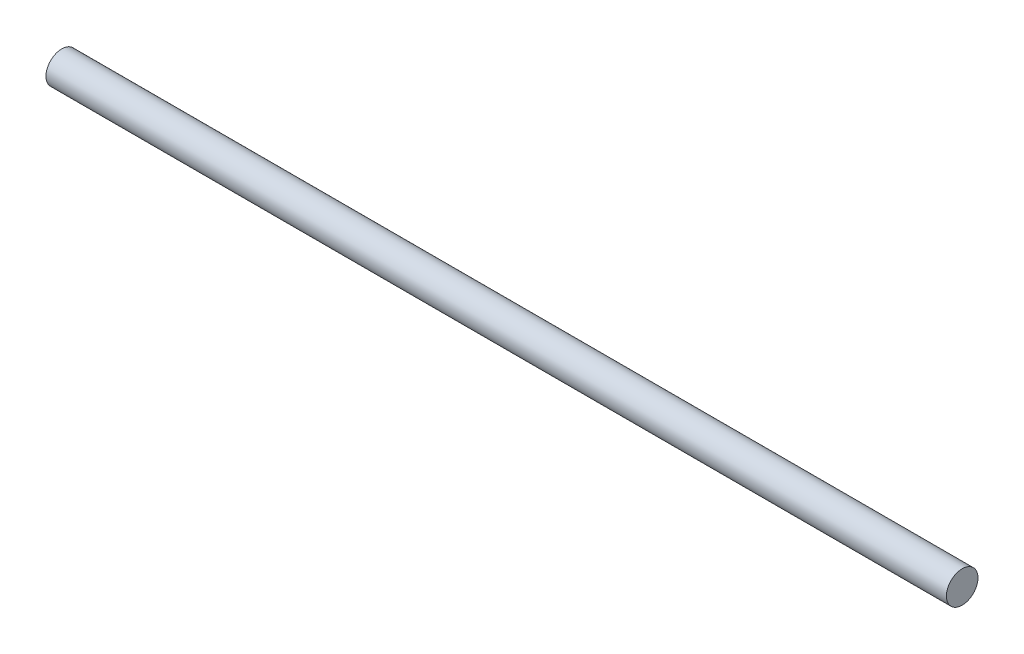
ISO-10303-21;
HEADER;
FILE_DESCRIPTION(('STEP AP214'),'2;1');
FILE_NAME('part.step','',(''),(''),'','','');
FILE_SCHEMA(('AUTOMOTIVE_DESIGN { 1 0 10303 214 1 1 1 1 }'));
ENDSEC;
DATA;
#1=APPLICATION_CONTEXT('core data for automotive mechanical design processes');
#2=APPLICATION_PROTOCOL_DEFINITION('international standard','automotive_design',2000,#1);
#3=PRODUCT_CONTEXT('',#1,'mechanical');
#4=PRODUCT('Part','Part','',(#3));
#5=PRODUCT_RELATED_PRODUCT_CATEGORY('part','',(#4));
#6=PRODUCT_DEFINITION_FORMATION('','',#4);
#7=PRODUCT_DEFINITION_CONTEXT('part definition',#1,'design');
#8=PRODUCT_DEFINITION('design','',#6,#7);
#9=PRODUCT_DEFINITION_SHAPE('','',#8);
#10=(LENGTH_UNIT() NAMED_UNIT(*) SI_UNIT(.MILLI.,.METRE.));
#11=(NAMED_UNIT(*) PLANE_ANGLE_UNIT() SI_UNIT($,.RADIAN.));
#12=(NAMED_UNIT(*) SI_UNIT($,.STERADIAN.) SOLID_ANGLE_UNIT());
#13=UNCERTAINTY_MEASURE_WITH_UNIT(LENGTH_MEASURE(1.E-05),#10,'distance_accuracy_value','');
#14=(GEOMETRIC_REPRESENTATION_CONTEXT(3) GLOBAL_UNCERTAINTY_ASSIGNED_CONTEXT((#13)) GLOBAL_UNIT_ASSIGNED_CONTEXT((#10,
#11,#12)) REPRESENTATION_CONTEXT('',''));
#15=CARTESIAN_POINT('',(0.,0.,0.));
#16=DIRECTION('',(0.,0.,1.));
#17=DIRECTION('',(1.,0.,0.));
#18=AXIS2_PLACEMENT_3D('',#15,#16,#17);
#19=CARTESIAN_POINT('',(723.9,0.,0.));
#20=DIRECTION('',(-1.,0.,0.));
#21=DIRECTION('',(0.,0.,1.));
#22=AXIS2_PLACEMENT_3D('',#19,#20,#21);
#23=CYLINDRICAL_SURFACE('',#22,12.7);
#24=CARTESIAN_POINT('',(723.9,0.,0.));
#25=DIRECTION('',(1.,0.,0.));
#26=DIRECTION('',(0.,0.,-1.));
#27=AXIS2_PLACEMENT_3D('',#24,#25,#26);
#28=CIRCLE('',#27,12.7);
#29=CARTESIAN_POINT('',(723.9,0.,-12.7));
#30=VERTEX_POINT('',#29);
#31=EDGE_CURVE('E10',#30,#30,#28,.T.);
#32=ORIENTED_EDGE('',*,*,#31,.F.);
#33=EDGE_LOOP('',(#32));
#34=FACE_BOUND('',#33,.T.);
#35=CARTESIAN_POINT('',(0.,0.,0.));
#36=DIRECTION('',(1.,0.,0.));
#37=DIRECTION('',(0.,0.,-1.));
#38=AXIS2_PLACEMENT_3D('',#35,#36,#37);
#39=CIRCLE('',#38,12.7);
#40=CARTESIAN_POINT('',(0.,0.,-12.7));
#41=VERTEX_POINT('',#40);
#42=EDGE_CURVE('E40',#41,#41,#39,.T.);
#43=ORIENTED_EDGE('',*,*,#42,.T.);
#44=EDGE_LOOP('',(#43));
#45=FACE_BOUND('',#44,.T.);
#46=ADVANCED_FACE('F37',(#34,#45),#23,.T.);
#47=CARTESIAN_POINT('',(723.9,0.,0.));
#48=DIRECTION('',(1.,0.,0.));
#49=DIRECTION('',(0.,0.,-1.));
#50=AXIS2_PLACEMENT_3D('',#47,#48,#49);
#51=PLANE('',#50);
#52=ORIENTED_EDGE('',*,*,#31,.T.);
#53=EDGE_LOOP('',(#52));
#54=FACE_BOUND('',#53,.T.);
#55=ADVANCED_FACE('F54',(#54),#51,.T.);
#56=CARTESIAN_POINT('',(0.,0.,0.));
#57=DIRECTION('',(1.,0.,0.));
#58=DIRECTION('',(0.,0.,-1.));
#59=AXIS2_PLACEMENT_3D('',#56,#57,#58);
#60=PLANE('',#59);
#61=ORIENTED_EDGE('',*,*,#42,.F.);
#62=EDGE_LOOP('',(#61));
#63=FACE_BOUND('',#62,.T.);
#64=ADVANCED_FACE('F52',(#63),#60,.F.);
#65=CLOSED_SHELL('',(#46,#55,#64));
#66=MANIFOLD_SOLID_BREP('B2',#65);
#67=ADVANCED_BREP_SHAPE_REPRESENTATION('',(#18,#66),#14);
#68=SHAPE_DEFINITION_REPRESENTATION(#9,#67);
ENDSEC;
END-ISO-10303-21;
